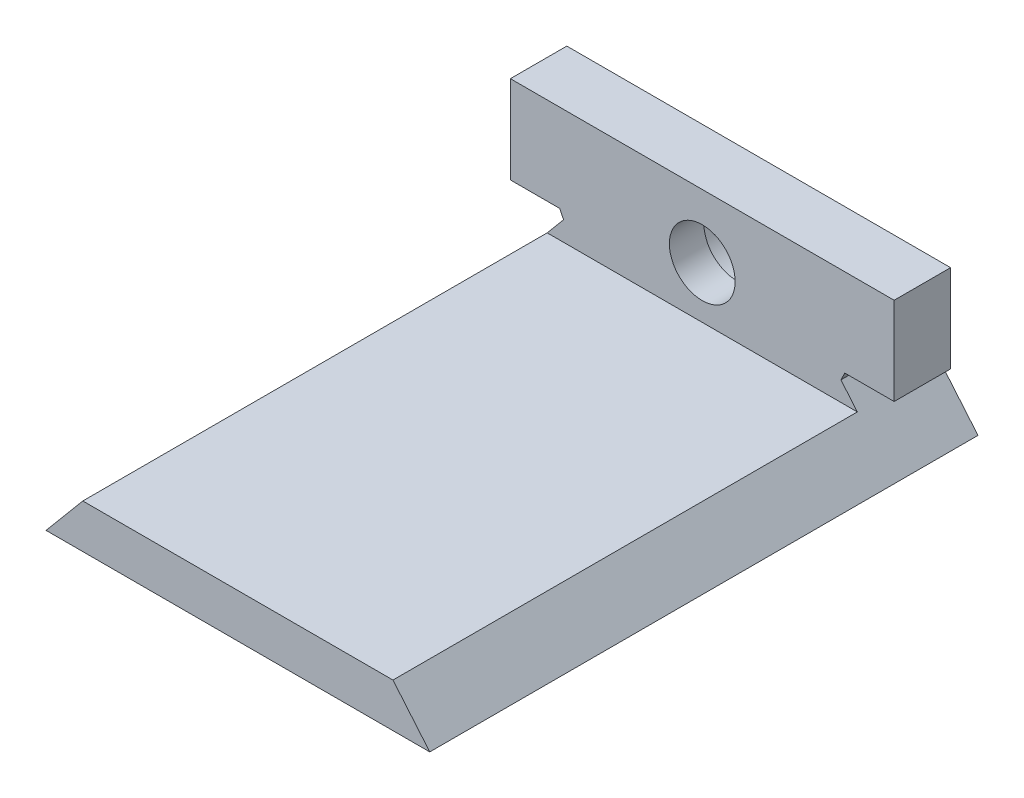
ISO-10303-21;
HEADER;
FILE_DESCRIPTION(('STEP AP214'),'2;1');
FILE_NAME('part.step','',(''),(''),'','','');
FILE_SCHEMA(('AUTOMOTIVE_DESIGN { 1 0 10303 214 1 1 1 1 }'));
ENDSEC;
DATA;
#1=APPLICATION_CONTEXT('core data for automotive mechanical design processes');
#2=APPLICATION_PROTOCOL_DEFINITION('international standard','automotive_design',2000,#1);
#3=PRODUCT_CONTEXT('',#1,'mechanical');
#4=PRODUCT('Part','Part','',(#3));
#5=PRODUCT_RELATED_PRODUCT_CATEGORY('part','',(#4));
#6=PRODUCT_DEFINITION_FORMATION('','',#4);
#7=PRODUCT_DEFINITION_CONTEXT('part definition',#1,'design');
#8=PRODUCT_DEFINITION('design','',#6,#7);
#9=PRODUCT_DEFINITION_SHAPE('','',#8);
#10=(LENGTH_UNIT() NAMED_UNIT(*) SI_UNIT(.MILLI.,.METRE.));
#11=(NAMED_UNIT(*) PLANE_ANGLE_UNIT() SI_UNIT($,.RADIAN.));
#12=(NAMED_UNIT(*) SI_UNIT($,.STERADIAN.) SOLID_ANGLE_UNIT());
#13=UNCERTAINTY_MEASURE_WITH_UNIT(LENGTH_MEASURE(1.E-05),#10,'distance_accuracy_value','');
#14=(GEOMETRIC_REPRESENTATION_CONTEXT(3) GLOBAL_UNCERTAINTY_ASSIGNED_CONTEXT((#13)) GLOBAL_UNIT_ASSIGNED_CONTEXT((#10,
#11,#12)) REPRESENTATION_CONTEXT('',''));
#15=CARTESIAN_POINT('',(0.,0.,0.));
#16=DIRECTION('',(0.,0.,1.));
#17=DIRECTION('',(1.,0.,0.));
#18=AXIS2_PLACEMENT_3D('',#15,#16,#17);
#19=CARTESIAN_POINT('',(35.,17.4360665057237,-37.0137427767077));
#20=DIRECTION('',(0.,0.,-1.));
#21=DIRECTION('',(-1.,0.,0.));
#22=AXIS2_PLACEMENT_3D('',#19,#20,#21);
#23=CYLINDRICAL_SURFACE('',#22,6.);
#24=CARTESIAN_POINT('',(35.,17.4360665057237,-63.7181010791114));
#25=DIRECTION('',(0.,0.,-1.));
#26=DIRECTION('',(-1.,0.,0.));
#27=AXIS2_PLACEMENT_3D('',#24,#25,#26);
#28=CIRCLE('',#27,6.);
#29=CARTESIAN_POINT('',(29.,17.4360665057237,-63.7181010791114));
#30=VERTEX_POINT('',#29);
#31=EDGE_CURVE('E237',#30,#30,#28,.T.);
#32=ORIENTED_EDGE('',*,*,#31,.F.);
#33=EDGE_LOOP('',(#32));
#34=FACE_BOUND('',#33,.T.);
#35=CARTESIAN_POINT('',(35.,17.4360665057237,-70.0137427767077));
#36=DIRECTION('',(0.,0.,-1.));
#37=DIRECTION('',(-1.,0.,0.));
#38=AXIS2_PLACEMENT_3D('',#35,#36,#37);
#39=CIRCLE('',#38,6.);
#40=CARTESIAN_POINT('',(29.,17.4360665057237,-70.0137427767077));
#41=VERTEX_POINT('',#40);
#42=EDGE_CURVE('E40',#41,#41,#39,.F.);
#43=ORIENTED_EDGE('',*,*,#42,.F.);
#44=EDGE_LOOP('',(#43));
#45=FACE_BOUND('',#44,.T.);
#46=ADVANCED_FACE('F36',(#34,#45),#23,.F.);
#47=CARTESIAN_POINT('',(70.,8.,20.9862572232923));
#48=DIRECTION('',(0.,0.,-1.));
#49=DIRECTION('',(-1.,0.,0.));
#50=AXIS2_PLACEMENT_3D('',#47,#48,#49);
#51=PLANE('',#50);
#52=DIRECTION('',(-1.,0.,0.));
#53=VECTOR('',#52,1.);
#54=CARTESIAN_POINT('',(70.,8.,20.9862572232923));
#55=LINE('',#54,#53);
#56=CARTESIAN_POINT('',(63.2872029505818,8.,20.9862572232923));
#57=VERTEX_POINT('',#56);
#58=CARTESIAN_POINT('',(6.71279704941821,8.,20.9862572232923));
#59=VERTEX_POINT('',#58);
#60=EDGE_CURVE('E219',#57,#59,#55,.T.);
#61=ORIENTED_EDGE('',*,*,#60,.T.);
#62=DIRECTION('',(-0.642787609686538,-0.76604444311898,0.));
#63=VECTOR('',#62,1.);
#64=CARTESIAN_POINT('',(32.8615447937061,39.162864066095,20.9862572232923));
#65=LINE('',#64,#63);
#66=CARTESIAN_POINT('',(0.,0.,20.9862572232923));
#67=VERTEX_POINT('',#66);
#68=EDGE_CURVE('E201',#59,#67,#65,.T.);
#69=ORIENTED_EDGE('',*,*,#68,.T.);
#70=DIRECTION('',(-1.,0.,0.));
#71=VECTOR('',#70,1.);
#72=CARTESIAN_POINT('',(70.,0.,20.9862572232923));
#73=LINE('',#72,#71);
#74=CARTESIAN_POINT('',(70.,0.,20.9862572232923));
#75=VERTEX_POINT('',#74);
#76=EDGE_CURVE('E227',#75,#67,#73,.T.);
#77=ORIENTED_EDGE('',*,*,#76,.F.);
#78=DIRECTION('',(-0.642787609686538,0.76604444311898,0.));
#79=VECTOR('',#78,1.);
#80=CARTESIAN_POINT('',(66.0607689879512,4.69459271066774,20.9862572232923));
#81=LINE('',#80,#79);
#82=EDGE_CURVE('E213',#75,#57,#81,.T.);
#83=ORIENTED_EDGE('',*,*,#82,.T.);
#84=EDGE_LOOP('',(#61,#69,#77,#83));
#85=FACE_BOUND('',#84,.T.);
#86=ADVANCED_FACE('F38',(#85),#51,.F.);
#87=CARTESIAN_POINT('',(70.,0.,20.9862572232923));
#88=DIRECTION('',(0.,1.,0.));
#89=DIRECTION('',(0.,0.,1.));
#90=AXIS2_PLACEMENT_3D('',#87,#88,#89);
#91=PLANE('',#90);
#92=DIRECTION('',(0.,0.,-1.));
#93=VECTOR('',#92,1.);
#94=CARTESIAN_POINT('',(0.,0.,20.9862572232923));
#95=LINE('',#94,#93);
#96=CARTESIAN_POINT('',(0.,0.,-79.0137427767077));
#97=VERTEX_POINT('',#96);
#98=EDGE_CURVE('E216',#67,#97,#95,.T.);
#99=ORIENTED_EDGE('',*,*,#98,.T.);
#100=DIRECTION('',(-1.,0.,0.));
#101=VECTOR('',#100,1.);
#102=CARTESIAN_POINT('',(70.,0.,-79.0137427767077));
#103=LINE('',#102,#101);
#104=CARTESIAN_POINT('',(70.,0.,-79.0137427767077));
#105=VERTEX_POINT('',#104);
#106=EDGE_CURVE('E224',#105,#97,#103,.T.);
#107=ORIENTED_EDGE('',*,*,#106,.F.);
#108=DIRECTION('',(0.,0.,-1.));
#109=VECTOR('',#108,1.);
#110=CARTESIAN_POINT('',(70.,0.,20.9862572232923));
#111=LINE('',#110,#109);
#112=EDGE_CURVE('E217',#75,#105,#111,.T.);
#113=ORIENTED_EDGE('',*,*,#112,.F.);
#114=ORIENTED_EDGE('',*,*,#76,.T.);
#115=EDGE_LOOP('',(#99,#107,#113,#114));
#116=FACE_BOUND('',#115,.T.);
#117=ADVANCED_FACE('F257',(#116),#91,.F.);
#118=CARTESIAN_POINT('',(70.,0.,-79.0137427767077));
#119=DIRECTION('',(0.,0.,1.));
#120=DIRECTION('',(1.,0.,0.));
#121=AXIS2_PLACEMENT_3D('',#118,#119,#120);
#122=PLANE('',#121);
#123=DIRECTION('',(-0.642787609686538,-0.766044443118979,0.));
#124=VECTOR('',#123,1.);
#125=CARTESIAN_POINT('',(9.70624552912504,11.5674529799363,-79.0137427767077));
#126=LINE('',#125,#124);
#127=CARTESIAN_POINT('',(8.39099631177277,10.,-79.0137427767077));
#128=VERTEX_POINT('',#127);
#129=EDGE_CURVE('E193',#128,#97,#126,.T.);
#130=ORIENTED_EDGE('',*,*,#129,.F.);
#131=DIRECTION('',(-1.,0.,0.));
#132=VECTOR('',#131,1.);
#133=CARTESIAN_POINT('',(74.198677084346,10.,-79.0137427767077));
#134=LINE('',#133,#132);
#135=CARTESIAN_POINT('',(61.6090036882272,10.,-79.0137427767077));
#136=VERTEX_POINT('',#135);
#137=EDGE_CURVE('E166',#136,#128,#134,.T.);
#138=ORIENTED_EDGE('',*,*,#137,.F.);
#139=DIRECTION('',(-0.642787609686538,0.766044443118979,0.));
#140=VECTOR('',#139,1.);
#141=CARTESIAN_POINT('',(60.293754470875,11.5674529799363,-79.0137427767077));
#142=LINE('',#141,#140);
#143=EDGE_CURVE('E204',#105,#136,#142,.T.);
#144=ORIENTED_EDGE('',*,*,#143,.F.);
#145=ORIENTED_EDGE('',*,*,#106,.T.);
#146=EDGE_LOOP('',(#130,#138,#144,#145));
#147=FACE_BOUND('',#146,.T.);
#148=ADVANCED_FACE('F307',(#147),#122,.F.);
#149=CARTESIAN_POINT('',(70.,8.00000000000002,-49.0137427767077));
#150=DIRECTION('',(0.,-1.,0.));
#151=DIRECTION('',(0.,0.,-1.));
#152=AXIS2_PLACEMENT_3D('',#149,#150,#151);
#153=PLANE('',#152);
#154=DIRECTION('',(0.,0.,-1.));
#155=VECTOR('',#154,1.);
#156=CARTESIAN_POINT('',(63.2872029505818,8.00000000000002,-49.0137427767077));
#157=LINE('',#156,#155);
#158=CARTESIAN_POINT('',(63.2872029505818,8.00000000000001,-63.7181010791114));
#159=VERTEX_POINT('',#158);
#160=EDGE_CURVE('E210',#57,#159,#157,.T.);
#161=ORIENTED_EDGE('',*,*,#160,.T.);
#162=DIRECTION('',(1.,0.,0.));
#163=VECTOR('',#162,1.);
#164=CARTESIAN_POINT('',(-6.99999999999999,8.00000000000001,-63.7181010791114));
#165=LINE('',#164,#163);
#166=CARTESIAN_POINT('',(6.71279704941822,8.00000000000001,-63.7181010791114));
#167=VERTEX_POINT('',#166);
#168=EDGE_CURVE('E242',#167,#159,#165,.T.);
#169=ORIENTED_EDGE('',*,*,#168,.F.);
#170=DIRECTION('',(0.,0.,1.));
#171=VECTOR('',#170,1.);
#172=CARTESIAN_POINT('',(6.71279704941823,8.00000000000002,-49.0137427767077));
#173=LINE('',#172,#171);
#174=EDGE_CURVE('E198',#167,#59,#173,.T.);
#175=ORIENTED_EDGE('',*,*,#174,.T.);
#176=ORIENTED_EDGE('',*,*,#60,.F.);
#177=EDGE_LOOP('',(#161,#169,#175,#176));
#178=FACE_BOUND('',#177,.T.);
#179=ADVANCED_FACE('F300',(#178),#153,.F.);
#180=CARTESIAN_POINT('',(70.,32.,-74.0137427767077));
#181=DIRECTION('',(1.,0.,0.));
#182=DIRECTION('',(0.,0.,-1.));
#183=AXIS2_PLACEMENT_3D('',#180,#181,#182);
#184=PLANE('',#183);
#185=DIRECTION('',(0.,1.,0.));
#186=VECTOR('',#185,1.);
#187=CARTESIAN_POINT('',(70.,29.,-63.7181010791114));
#188=LINE('',#187,#186);
#189=CARTESIAN_POINT('',(70.,13.,-63.7181010791114));
#190=VERTEX_POINT('',#189);
#191=CARTESIAN_POINT('',(70.,29.,-63.7181010791114));
#192=VERTEX_POINT('',#191);
#193=EDGE_CURVE('E239',#190,#192,#188,.T.);
#194=ORIENTED_EDGE('',*,*,#193,.F.);
#195=DIRECTION('',(0.,0.,1.));
#196=VECTOR('',#195,1.);
#197=CARTESIAN_POINT('',(70.,13.,-74.0137427767077));
#198=LINE('',#197,#196);
#199=CARTESIAN_POINT('',(70.,13.,-74.0137427767077));
#200=VERTEX_POINT('',#199);
#201=EDGE_CURVE('E230',#200,#190,#198,.T.);
#202=ORIENTED_EDGE('',*,*,#201,.F.);
#203=DIRECTION('',(0.,-1.,0.));
#204=VECTOR('',#203,1.);
#205=CARTESIAN_POINT('',(70.,32.,-74.0137427767077));
#206=LINE('',#205,#204);
#207=CARTESIAN_POINT('',(70.,29.,-74.0137427767077));
#208=VERTEX_POINT('',#207);
#209=EDGE_CURVE('E188',#208,#200,#206,.T.);
#210=ORIENTED_EDGE('',*,*,#209,.F.);
#211=DIRECTION('',(0.,0.,-1.));
#212=VECTOR('',#211,1.);
#213=CARTESIAN_POINT('',(70.,29.,-74.0137427767077));
#214=LINE('',#213,#212);
#215=EDGE_CURVE('E60',#192,#208,#214,.T.);
#216=ORIENTED_EDGE('',*,*,#215,.F.);
#217=EDGE_LOOP('',(#194,#202,#210,#216));
#218=FACE_BOUND('',#217,.T.);
#219=ADVANCED_FACE('F297',(#218),#184,.T.);
#220=CARTESIAN_POINT('',(0.,32.,-74.0137427767077));
#221=DIRECTION('',(1.,0.,0.));
#222=DIRECTION('',(0.,0.,-1.));
#223=AXIS2_PLACEMENT_3D('',#220,#221,#222);
#224=PLANE('',#223);
#225=DIRECTION('',(0.,0.,1.));
#226=VECTOR('',#225,1.);
#227=CARTESIAN_POINT('',(0.,13.,-74.0137427767077));
#228=LINE('',#227,#226);
#229=CARTESIAN_POINT('',(0.,13.,-74.0137427767077));
#230=VERTEX_POINT('',#229);
#231=CARTESIAN_POINT('',(0.,13.,-63.7181010791114));
#232=VERTEX_POINT('',#231);
#233=EDGE_CURVE('E233',#230,#232,#228,.T.);
#234=ORIENTED_EDGE('',*,*,#233,.T.);
#235=DIRECTION('',(0.,1.,0.));
#236=VECTOR('',#235,1.);
#237=CARTESIAN_POINT('',(0.,32.,-63.7181010791114));
#238=LINE('',#237,#236);
#239=CARTESIAN_POINT('',(0.,29.,-63.7181010791114));
#240=VERTEX_POINT('',#239);
#241=EDGE_CURVE('E341',#232,#240,#238,.T.);
#242=ORIENTED_EDGE('',*,*,#241,.T.);
#243=DIRECTION('',(0.,0.,1.));
#244=VECTOR('',#243,1.);
#245=CARTESIAN_POINT('',(0.,29.,-75.2484547603388));
#246=LINE('',#245,#244);
#247=CARTESIAN_POINT('',(0.,29.,-74.0137427767077));
#248=VERTEX_POINT('',#247);
#249=EDGE_CURVE('E352',#248,#240,#246,.T.);
#250=ORIENTED_EDGE('',*,*,#249,.F.);
#251=DIRECTION('',(0.,1.,0.));
#252=VECTOR('',#251,1.);
#253=CARTESIAN_POINT('',(0.,10.,-74.0137427767077));
#254=LINE('',#253,#252);
#255=EDGE_CURVE('E169',#230,#248,#254,.T.);
#256=ORIENTED_EDGE('',*,*,#255,.F.);
#257=EDGE_LOOP('',(#234,#242,#250,#256));
#258=FACE_BOUND('',#257,.T.);
#259=ADVANCED_FACE('F295',(#258),#224,.F.);
#260=CARTESIAN_POINT('',(61.,13.,83.9862572232924));
#261=DIRECTION('',(-0.896924514066137,0.44218369041296,0.));
#262=DIRECTION('',(-0.44218369041296,-0.896924514066137,0.));
#263=AXIS2_PLACEMENT_3D('',#260,#261,#262);
#264=PLANE('',#263);
#265=DIRECTION('',(0.,0.,-1.));
#266=VECTOR('',#265,1.);
#267=CARTESIAN_POINT('',(61.,13.,83.9862572232924));
#268=LINE('',#267,#266);
#269=CARTESIAN_POINT('',(61.,13.,-63.7181010791114));
#270=VERTEX_POINT('',#269);
#271=CARTESIAN_POINT('',(61.,13.,-74.0137427767077));
#272=VERTEX_POINT('',#271);
#273=EDGE_CURVE('E207',#270,#272,#268,.T.);
#274=ORIENTED_EDGE('',*,*,#273,.F.);
#275=DIRECTION('',(-0.44218369041296,-0.896924514066137,0.));
#276=VECTOR('',#275,1.);
#277=CARTESIAN_POINT('',(61.,13.,-63.7181010791114));
#278=LINE('',#277,#276);
#279=CARTESIAN_POINT('',(60.293754470875,11.5674529799363,-63.7181010791114));
#280=VERTEX_POINT('',#279);
#281=EDGE_CURVE('E347',#270,#280,#278,.T.);
#282=ORIENTED_EDGE('',*,*,#281,.T.);
#283=DIRECTION('',(0.,0.,-1.));
#284=VECTOR('',#283,1.);
#285=CARTESIAN_POINT('',(60.293754470875,11.5674529799363,83.9862572232924));
#286=LINE('',#285,#284);
#287=CARTESIAN_POINT('',(60.293754470875,11.5674529799363,-74.0137427767077));
#288=VERTEX_POINT('',#287);
#289=EDGE_CURVE('E208',#280,#288,#286,.T.);
#290=ORIENTED_EDGE('',*,*,#289,.T.);
#291=DIRECTION('',(0.44218369041296,0.896924514066137,0.));
#292=VECTOR('',#291,1.);
#293=CARTESIAN_POINT('',(61.,13.,-74.0137427767077));
#294=LINE('',#293,#292);
#295=EDGE_CURVE('E185',#288,#272,#294,.T.);
#296=ORIENTED_EDGE('',*,*,#295,.T.);
#297=EDGE_LOOP('',(#274,#282,#290,#296));
#298=FACE_BOUND('',#297,.T.);
#299=ADVANCED_FACE('F288',(#298),#264,.F.);
#300=CARTESIAN_POINT('',(60.293754470875,11.5674529799363,83.9862572232924));
#301=DIRECTION('',(-0.766044443118979,-0.642787609686538,0.));
#302=DIRECTION('',(0.642787609686538,-0.76604444311898,0.));
#303=AXIS2_PLACEMENT_3D('',#300,#301,#302);
#304=PLANE('',#303);
#305=ORIENTED_EDGE('',*,*,#289,.F.);
#306=DIRECTION('',(0.642787609686538,-0.76604444311898,0.));
#307=VECTOR('',#306,1.);
#308=CARTESIAN_POINT('',(60.293754470875,11.5674529799363,-63.7181010791114));
#309=LINE('',#308,#307);
#310=EDGE_CURVE('E350',#280,#159,#309,.T.);
#311=ORIENTED_EDGE('',*,*,#310,.T.);
#312=ORIENTED_EDGE('',*,*,#160,.F.);
#313=ORIENTED_EDGE('',*,*,#82,.F.);
#314=ORIENTED_EDGE('',*,*,#112,.T.);
#315=ORIENTED_EDGE('',*,*,#143,.T.);
#316=DIRECTION('',(0.,0.,1.));
#317=VECTOR('',#316,1.);
#318=CARTESIAN_POINT('',(61.6090036882272,10.,83.9862572232924));
#319=LINE('',#318,#317);
#320=CARTESIAN_POINT('',(61.6090036882272,10.,-74.0137427767077));
#321=VERTEX_POINT('',#320);
#322=EDGE_CURVE('E168',#136,#321,#319,.T.);
#323=ORIENTED_EDGE('',*,*,#322,.T.);
#324=DIRECTION('',(-0.642787609686538,0.76604444311898,0.));
#325=VECTOR('',#324,1.);
#326=CARTESIAN_POINT('',(60.293754470875,11.5674529799363,-74.0137427767077));
#327=LINE('',#326,#325);
#328=EDGE_CURVE('E190',#321,#288,#327,.T.);
#329=ORIENTED_EDGE('',*,*,#328,.T.);
#330=EDGE_LOOP('',(#305,#311,#312,#313,#314,#315,#323,#329));
#331=FACE_BOUND('',#330,.T.);
#332=ADVANCED_FACE('F285',(#331),#304,.F.);
#333=CARTESIAN_POINT('',(61.,13.,83.9862572232924));
#334=DIRECTION('',(0.,1.,0.));
#335=DIRECTION('',(-1.,0.,0.));
#336=AXIS2_PLACEMENT_3D('',#333,#334,#335);
#337=PLANE('',#336);
#338=ORIENTED_EDGE('',*,*,#201,.T.);
#339=DIRECTION('',(-1.,0.,0.));
#340=VECTOR('',#339,1.);
#341=CARTESIAN_POINT('',(61.,13.,-63.7181010791114));
#342=LINE('',#341,#340);
#343=EDGE_CURVE('E344',#190,#270,#342,.T.);
#344=ORIENTED_EDGE('',*,*,#343,.T.);
#345=ORIENTED_EDGE('',*,*,#273,.T.);
#346=DIRECTION('',(1.,0.,0.));
#347=VECTOR('',#346,1.);
#348=CARTESIAN_POINT('',(61.,13.,-74.0137427767077));
#349=LINE('',#348,#347);
#350=EDGE_CURVE('E182',#272,#200,#349,.T.);
#351=ORIENTED_EDGE('',*,*,#350,.T.);
#352=EDGE_LOOP('',(#338,#344,#345,#351));
#353=FACE_BOUND('',#352,.T.);
#354=ADVANCED_FACE('F280',(#353),#337,.F.);
#355=CARTESIAN_POINT('',(9.,13.,83.9862572232924));
#356=DIRECTION('',(0.896924514066137,0.44218369041296,0.));
#357=DIRECTION('',(-0.44218369041296,0.896924514066137,0.));
#358=AXIS2_PLACEMENT_3D('',#355,#356,#357);
#359=PLANE('',#358);
#360=DIRECTION('',(0.,0.,-1.));
#361=VECTOR('',#360,1.);
#362=CARTESIAN_POINT('',(9.70624552912504,11.5674529799363,83.9862572232924));
#363=LINE('',#362,#361);
#364=CARTESIAN_POINT('',(9.70624552912504,11.5674529799363,-63.7181010791114));
#365=VERTEX_POINT('',#364);
#366=CARTESIAN_POINT('',(9.70624552912504,11.5674529799363,-74.0137427767077));
#367=VERTEX_POINT('',#366);
#368=EDGE_CURVE('E196',#365,#367,#363,.T.);
#369=ORIENTED_EDGE('',*,*,#368,.F.);
#370=DIRECTION('',(-0.44218369041296,0.896924514066137,0.));
#371=VECTOR('',#370,1.);
#372=CARTESIAN_POINT('',(9.,13.,-63.7181010791114));
#373=LINE('',#372,#371);
#374=CARTESIAN_POINT('',(9.,13.,-63.7181010791114));
#375=VERTEX_POINT('',#374);
#376=EDGE_CURVE('E333',#365,#375,#373,.T.);
#377=ORIENTED_EDGE('',*,*,#376,.T.);
#378=DIRECTION('',(0.,0.,-1.));
#379=VECTOR('',#378,1.);
#380=CARTESIAN_POINT('',(9.,13.,83.9862572232924));
#381=LINE('',#380,#379);
#382=CARTESIAN_POINT('',(9.,13.,-74.0137427767077));
#383=VERTEX_POINT('',#382);
#384=EDGE_CURVE('E195',#375,#383,#381,.T.);
#385=ORIENTED_EDGE('',*,*,#384,.T.);
#386=DIRECTION('',(0.44218369041296,-0.896924514066137,0.));
#387=VECTOR('',#386,1.);
#388=CARTESIAN_POINT('',(9.,13.,-74.0137427767077));
#389=LINE('',#388,#387);
#390=EDGE_CURVE('E176',#383,#367,#389,.T.);
#391=ORIENTED_EDGE('',*,*,#390,.T.);
#392=EDGE_LOOP('',(#369,#377,#385,#391));
#393=FACE_BOUND('',#392,.T.);
#394=ADVANCED_FACE('F277',(#393),#359,.F.);
#395=CARTESIAN_POINT('',(9.,13.,83.9862572232924));
#396=DIRECTION('',(0.,1.,0.));
#397=DIRECTION('',(-1.,0.,0.));
#398=AXIS2_PLACEMENT_3D('',#395,#396,#397);
#399=PLANE('',#398);
#400=ORIENTED_EDGE('',*,*,#384,.F.);
#401=DIRECTION('',(-1.,0.,0.));
#402=VECTOR('',#401,1.);
#403=CARTESIAN_POINT('',(9.,13.,-63.7181010791114));
#404=LINE('',#403,#402);
#405=EDGE_CURVE('E338',#375,#232,#404,.T.);
#406=ORIENTED_EDGE('',*,*,#405,.T.);
#407=ORIENTED_EDGE('',*,*,#233,.F.);
#408=DIRECTION('',(1.,0.,0.));
#409=VECTOR('',#408,1.);
#410=CARTESIAN_POINT('',(9.,13.,-74.0137427767077));
#411=LINE('',#410,#409);
#412=EDGE_CURVE('E179',#230,#383,#411,.T.);
#413=ORIENTED_EDGE('',*,*,#412,.T.);
#414=EDGE_LOOP('',(#400,#406,#407,#413));
#415=FACE_BOUND('',#414,.T.);
#416=ADVANCED_FACE('F275',(#415),#399,.F.);
#417=CARTESIAN_POINT('',(9.70624552912504,11.5674529799363,83.9862572232924));
#418=DIRECTION('',(0.766044443118979,-0.642787609686538,0.));
#419=DIRECTION('',(0.642787609686538,0.76604444311898,0.));
#420=AXIS2_PLACEMENT_3D('',#417,#418,#419);
#421=PLANE('',#420);
#422=ORIENTED_EDGE('',*,*,#174,.F.);
#423=DIRECTION('',(0.642787609686538,0.76604444311898,0.));
#424=VECTOR('',#423,1.);
#425=CARTESIAN_POINT('',(9.70624552912504,11.5674529799363,-63.7181010791114));
#426=LINE('',#425,#424);
#427=EDGE_CURVE('E326',#167,#365,#426,.T.);
#428=ORIENTED_EDGE('',*,*,#427,.T.);
#429=ORIENTED_EDGE('',*,*,#368,.T.);
#430=DIRECTION('',(-0.642787609686538,-0.76604444311898,0.));
#431=VECTOR('',#430,1.);
#432=CARTESIAN_POINT('',(9.70624552912504,11.5674529799363,-74.0137427767077));
#433=LINE('',#432,#431);
#434=CARTESIAN_POINT('',(8.39099631177276,10.,-74.0137427767077));
#435=VERTEX_POINT('',#434);
#436=EDGE_CURVE('E45',#367,#435,#433,.T.);
#437=ORIENTED_EDGE('',*,*,#436,.T.);
#438=DIRECTION('',(0.,0.,-1.));
#439=VECTOR('',#438,1.);
#440=CARTESIAN_POINT('',(8.39099631177277,10.,83.9862572232924));
#441=LINE('',#440,#439);
#442=EDGE_CURVE('E164',#435,#128,#441,.T.);
#443=ORIENTED_EDGE('',*,*,#442,.T.);
#444=ORIENTED_EDGE('',*,*,#129,.T.);
#445=ORIENTED_EDGE('',*,*,#98,.F.);
#446=ORIENTED_EDGE('',*,*,#68,.F.);
#447=EDGE_LOOP('',(#422,#428,#429,#437,#443,#444,#445,#446));
#448=FACE_BOUND('',#447,.T.);
#449=ADVANCED_FACE('F270',(#448),#421,.F.);
#450=CARTESIAN_POINT('',(74.198677084346,10.,-74.0137427767077));
#451=DIRECTION('',(0.,0.,1.));
#452=DIRECTION('',(1.,0.,0.));
#453=AXIS2_PLACEMENT_3D('',#450,#451,#452);
#454=PLANE('',#453);
#455=DIRECTION('',(-1.,0.,0.));
#456=VECTOR('',#455,1.);
#457=CARTESIAN_POINT('',(74.198677084346,10.,-74.0137427767077));
#458=LINE('',#457,#456);
#459=CARTESIAN_POINT('',(37.9504092804989,10.,-74.0137427767077));
#460=VERTEX_POINT('',#459);
#461=EDGE_CURVE('E161',#321,#460,#458,.T.);
#462=ORIENTED_EDGE('',*,*,#461,.T.);
#463=CARTESIAN_POINT('',(35.,17.4360665057237,-74.0137427767077));
#464=DIRECTION('',(0.,0.,-1.));
#465=DIRECTION('',(-1.,0.,0.));
#466=AXIS2_PLACEMENT_3D('',#463,#464,#465);
#467=CIRCLE('',#466,8.);
#468=CARTESIAN_POINT('',(32.0495907195011,10.,-74.0137427767077));
#469=VERTEX_POINT('',#468);
#470=EDGE_CURVE('E154',#469,#460,#467,.T.);
#471=ORIENTED_EDGE('',*,*,#470,.F.);
#472=EDGE_CURVE('E159',#469,#435,#458,.T.);
#473=ORIENTED_EDGE('',*,*,#472,.T.);
#474=ORIENTED_EDGE('',*,*,#436,.F.);
#475=ORIENTED_EDGE('',*,*,#390,.F.);
#476=ORIENTED_EDGE('',*,*,#412,.F.);
#477=ORIENTED_EDGE('',*,*,#255,.T.);
#478=DIRECTION('',(1.,0.,0.));
#479=VECTOR('',#478,1.);
#480=CARTESIAN_POINT('',(74.198677084346,29.,-74.0137427767077));
#481=LINE('',#480,#479);
#482=EDGE_CURVE('E11',#248,#208,#481,.T.);
#483=ORIENTED_EDGE('',*,*,#482,.T.);
#484=ORIENTED_EDGE('',*,*,#209,.T.);
#485=ORIENTED_EDGE('',*,*,#350,.F.);
#486=ORIENTED_EDGE('',*,*,#295,.F.);
#487=ORIENTED_EDGE('',*,*,#328,.F.);
#488=EDGE_LOOP('',(#462,#471,#473,#474,#475,#476,#477,#483,#484,#485,#486,#487));
#489=FACE_BOUND('',#488,.T.);
#490=ADVANCED_FACE('F157',(#489),#454,.F.);
#491=CARTESIAN_POINT('',(74.198677084346,10.,-79.0137427767077));
#492=DIRECTION('',(0.,-1.,0.));
#493=DIRECTION('',(0.,0.,-1.));
#494=AXIS2_PLACEMENT_3D('',#491,#492,#493);
#495=PLANE('',#494);
#496=ORIENTED_EDGE('',*,*,#137,.T.);
#497=ORIENTED_EDGE('',*,*,#442,.F.);
#498=ORIENTED_EDGE('',*,*,#472,.F.);
#499=DIRECTION('',(1.,0.,0.));
#500=VECTOR('',#499,1.);
#501=CARTESIAN_POINT('',(74.198677084346,10.,-74.0137427767077));
#502=LINE('',#501,#500);
#503=EDGE_CURVE('E143',#469,#460,#502,.T.);
#504=ORIENTED_EDGE('',*,*,#503,.T.);
#505=ORIENTED_EDGE('',*,*,#461,.F.);
#506=ORIENTED_EDGE('',*,*,#322,.F.);
#507=EDGE_LOOP('',(#496,#497,#498,#504,#505,#506));
#508=FACE_BOUND('',#507,.T.);
#509=ADVANCED_FACE('F162',(#508),#495,.F.);
#510=CARTESIAN_POINT('',(77.198677084346,29.,-75.2484547603388));
#511=DIRECTION('',(0.,-1.,0.));
#512=DIRECTION('',(0.,0.,-1.));
#513=AXIS2_PLACEMENT_3D('',#510,#511,#512);
#514=PLANE('',#513);
#515=ORIENTED_EDGE('',*,*,#215,.T.);
#516=ORIENTED_EDGE('',*,*,#482,.F.);
#517=ORIENTED_EDGE('',*,*,#249,.T.);
#518=DIRECTION('',(-1.,0.,0.));
#519=VECTOR('',#518,1.);
#520=CARTESIAN_POINT('',(70.,29.,-63.7181010791114));
#521=LINE('',#520,#519);
#522=EDGE_CURVE('E355',#192,#240,#521,.T.);
#523=ORIENTED_EDGE('',*,*,#522,.F.);
#524=EDGE_LOOP('',(#515,#516,#517,#523));
#525=FACE_BOUND('',#524,.T.);
#526=ADVANCED_FACE('F265',(#525),#514,.F.);
#527=CARTESIAN_POINT('',(-6.99999999999999,29.,-63.7181010791114));
#528=DIRECTION('',(0.,0.,-1.));
#529=DIRECTION('',(-1.,0.,0.));
#530=AXIS2_PLACEMENT_3D('',#527,#528,#529);
#531=PLANE('',#530);
#532=ORIENTED_EDGE('',*,*,#31,.T.);
#533=EDGE_LOOP('',(#532));
#534=FACE_BOUND('',#533,.T.);
#535=ORIENTED_EDGE('',*,*,#281,.F.);
#536=ORIENTED_EDGE('',*,*,#343,.F.);
#537=ORIENTED_EDGE('',*,*,#193,.T.);
#538=ORIENTED_EDGE('',*,*,#522,.T.);
#539=ORIENTED_EDGE('',*,*,#241,.F.);
#540=ORIENTED_EDGE('',*,*,#405,.F.);
#541=ORIENTED_EDGE('',*,*,#376,.F.);
#542=ORIENTED_EDGE('',*,*,#427,.F.);
#543=ORIENTED_EDGE('',*,*,#168,.T.);
#544=ORIENTED_EDGE('',*,*,#310,.F.);
#545=EDGE_LOOP('',(#535,#536,#537,#538,#539,#540,#541,#542,#543,#544));
#546=FACE_BOUND('',#545,.T.);
#547=ADVANCED_FACE('F262',(#534,#546),#531,.F.);
#548=CARTESIAN_POINT('',(35.,17.4360665057237,-70.0137427767077));
#549=DIRECTION('',(0.,0.,-1.));
#550=DIRECTION('',(-1.,0.,0.));
#551=AXIS2_PLACEMENT_3D('',#548,#549,#550);
#552=PLANE('',#551);
#553=CARTESIAN_POINT('',(35.,17.4360665057237,-70.0137427767077));
#554=DIRECTION('',(0.,0.,-1.));
#555=DIRECTION('',(-1.,0.,0.));
#556=AXIS2_PLACEMENT_3D('',#553,#554,#555);
#557=CIRCLE('',#556,8.);
#558=CARTESIAN_POINT('',(27.,17.4360665057237,-70.0137427767077));
#559=VERTEX_POINT('',#558);
#560=EDGE_CURVE('E149',#559,#559,#557,.T.);
#561=ORIENTED_EDGE('',*,*,#560,.T.);
#562=EDGE_LOOP('',(#561));
#563=FACE_BOUND('',#562,.T.);
#564=ORIENTED_EDGE('',*,*,#42,.T.);
#565=EDGE_LOOP('',(#564));
#566=FACE_BOUND('',#565,.T.);
#567=ADVANCED_FACE('F247',(#563,#566),#552,.T.);
#568=CARTESIAN_POINT('',(35.,17.4360665057237,-74.0137427767077));
#569=DIRECTION('',(0.,0.,-1.));
#570=DIRECTION('',(-1.,0.,0.));
#571=AXIS2_PLACEMENT_3D('',#568,#569,#570);
#572=PLANE('',#571);
#573=EDGE_CURVE('E52',#460,#469,#467,.T.);
#574=ORIENTED_EDGE('',*,*,#573,.F.);
#575=ORIENTED_EDGE('',*,*,#503,.F.);
#576=EDGE_LOOP('',(#574,#575));
#577=FACE_BOUND('',#576,.T.);
#578=ADVANCED_FACE('F144',(#577),#572,.F.);
#579=CARTESIAN_POINT('',(35.,17.4360665057237,-70.0137427767077));
#580=DIRECTION('',(0.,0.,-1.));
#581=DIRECTION('',(-1.,0.,0.));
#582=AXIS2_PLACEMENT_3D('',#579,#580,#581);
#583=CYLINDRICAL_SURFACE('',#582,8.);
#584=ORIENTED_EDGE('',*,*,#560,.F.);
#585=EDGE_LOOP('',(#584));
#586=FACE_BOUND('',#585,.T.);
#587=ORIENTED_EDGE('',*,*,#573,.T.);
#588=ORIENTED_EDGE('',*,*,#470,.T.);
#589=EDGE_LOOP('',(#587,#588));
#590=FACE_BOUND('',#589,.T.);
#591=ADVANCED_FACE('F153',(#586,#590),#583,.F.);
#592=CLOSED_SHELL('',(#46,#86,#117,#148,#179,#219,#259,#299,#332,#354,#394,#416,#449,#490,#509,
#526,#547,#567,#578,#591));
#593=MANIFOLD_SOLID_BREP('B2',#592);
#594=ADVANCED_BREP_SHAPE_REPRESENTATION('',(#18,#593),#14);
#595=SHAPE_DEFINITION_REPRESENTATION(#9,#594);
ENDSEC;
END-ISO-10303-21;
